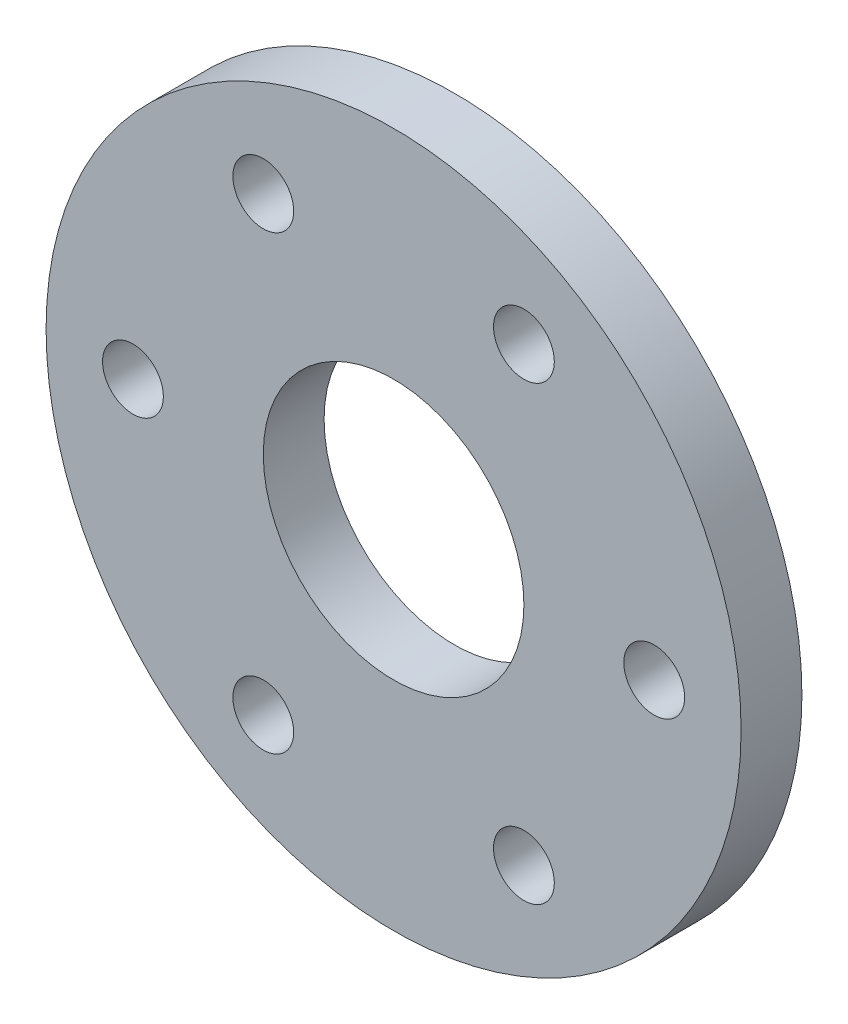
ISO-10303-21;
HEADER;
FILE_DESCRIPTION(('STEP AP214'),'2;1');
FILE_NAME('part.step','',(''),(''),'','','');
FILE_SCHEMA(('AUTOMOTIVE_DESIGN { 1 0 10303 214 1 1 1 1 }'));
ENDSEC;
DATA;
#1=APPLICATION_CONTEXT('core data for automotive mechanical design processes');
#2=APPLICATION_PROTOCOL_DEFINITION('international standard','automotive_design',2000,#1);
#3=PRODUCT_CONTEXT('',#1,'mechanical');
#4=PRODUCT('Part','Part','',(#3));
#5=PRODUCT_RELATED_PRODUCT_CATEGORY('part','',(#4));
#6=PRODUCT_DEFINITION_FORMATION('','',#4);
#7=PRODUCT_DEFINITION_CONTEXT('part definition',#1,'design');
#8=PRODUCT_DEFINITION('design','',#6,#7);
#9=PRODUCT_DEFINITION_SHAPE('','',#8);
#10=(LENGTH_UNIT() NAMED_UNIT(*) SI_UNIT(.MILLI.,.METRE.));
#11=(NAMED_UNIT(*) PLANE_ANGLE_UNIT() SI_UNIT($,.RADIAN.));
#12=(NAMED_UNIT(*) SI_UNIT($,.STERADIAN.) SOLID_ANGLE_UNIT());
#13=UNCERTAINTY_MEASURE_WITH_UNIT(LENGTH_MEASURE(1.E-05),#10,'distance_accuracy_value','');
#14=(GEOMETRIC_REPRESENTATION_CONTEXT(3) GLOBAL_UNCERTAINTY_ASSIGNED_CONTEXT((#13)) GLOBAL_UNIT_ASSIGNED_CONTEXT((#10,
#11,#12)) REPRESENTATION_CONTEXT('',''));
#15=CARTESIAN_POINT('',(0.,0.,0.));
#16=DIRECTION('',(0.,0.,1.));
#17=DIRECTION('',(1.,0.,0.));
#18=AXIS2_PLACEMENT_3D('',#15,#16,#17);
#19=CARTESIAN_POINT('',(0.,0.,14.));
#20=DIRECTION('',(0.,0.,1.));
#21=DIRECTION('',(1.,0.,0.));
#22=AXIS2_PLACEMENT_3D('',#19,#20,#21);
#23=PLANE('',#22);
#24=CARTESIAN_POINT('',(-30.,-51.9615242270663,14.));
#25=DIRECTION('',(0.,0.,1.));
#26=DIRECTION('',(1.,0.,0.));
#27=AXIS2_PLACEMENT_3D('',#24,#25,#26);
#28=CIRCLE('',#27,7.);
#29=CARTESIAN_POINT('',(-23.,-51.9615242270663,14.));
#30=VERTEX_POINT('',#29);
#31=EDGE_CURVE('E73',#30,#30,#28,.T.);
#32=ORIENTED_EDGE('',*,*,#31,.F.);
#33=EDGE_LOOP('',(#32));
#34=FACE_BOUND('',#33,.T.);
#35=CARTESIAN_POINT('',(-30.,51.9615242270663,14.));
#36=DIRECTION('',(0.,0.,1.));
#37=DIRECTION('',(1.,0.,0.));
#38=AXIS2_PLACEMENT_3D('',#35,#36,#37);
#39=CIRCLE('',#38,7.);
#40=CARTESIAN_POINT('',(-23.,51.9615242270663,14.));
#41=VERTEX_POINT('',#40);
#42=EDGE_CURVE('E61',#41,#41,#39,.T.);
#43=ORIENTED_EDGE('',*,*,#42,.F.);
#44=EDGE_LOOP('',(#43));
#45=FACE_BOUND('',#44,.T.);
#46=CARTESIAN_POINT('',(60.,0.,14.));
#47=DIRECTION('',(0.,0.,1.));
#48=DIRECTION('',(1.,0.,0.));
#49=AXIS2_PLACEMENT_3D('',#46,#47,#48);
#50=CIRCLE('',#49,7.00000000000001);
#51=CARTESIAN_POINT('',(67.,0.,14.));
#52=VERTEX_POINT('',#51);
#53=EDGE_CURVE('E49',#52,#52,#50,.T.);
#54=ORIENTED_EDGE('',*,*,#53,.F.);
#55=EDGE_LOOP('',(#54));
#56=FACE_BOUND('',#55,.T.);
#57=CARTESIAN_POINT('',(0.,0.,14.));
#58=DIRECTION('',(0.,0.,1.));
#59=DIRECTION('',(1.,0.,0.));
#60=AXIS2_PLACEMENT_3D('',#57,#58,#59);
#61=CIRCLE('',#60,80.);
#62=CARTESIAN_POINT('',(80.,0.,14.));
#63=VERTEX_POINT('',#62);
#64=EDGE_CURVE('E10',#63,#63,#61,.T.);
#65=ORIENTED_EDGE('',*,*,#64,.T.);
#66=EDGE_LOOP('',(#65));
#67=FACE_BOUND('',#66,.T.);
#68=CARTESIAN_POINT('',(0.,0.,14.));
#69=DIRECTION('',(0.,0.,1.));
#70=DIRECTION('',(1.,0.,0.));
#71=AXIS2_PLACEMENT_3D('',#68,#69,#70);
#72=CIRCLE('',#71,30.);
#73=CARTESIAN_POINT('',(30.,0.,14.));
#74=VERTEX_POINT('',#73);
#75=EDGE_CURVE('E44',#74,#74,#72,.T.);
#76=ORIENTED_EDGE('',*,*,#75,.F.);
#77=EDGE_LOOP('',(#76));
#78=FACE_BOUND('',#77,.T.);
#79=CARTESIAN_POINT('',(30.,51.9615242270663,14.));
#80=DIRECTION('',(0.,0.,1.));
#81=DIRECTION('',(1.,0.,0.));
#82=AXIS2_PLACEMENT_3D('',#79,#80,#81);
#83=CIRCLE('',#82,7.);
#84=CARTESIAN_POINT('',(37.,51.9615242270663,14.));
#85=VERTEX_POINT('',#84);
#86=EDGE_CURVE('E55',#85,#85,#83,.T.);
#87=ORIENTED_EDGE('',*,*,#86,.F.);
#88=EDGE_LOOP('',(#87));
#89=FACE_BOUND('',#88,.T.);
#90=CARTESIAN_POINT('',(-60.,0.,14.));
#91=DIRECTION('',(0.,0.,1.));
#92=DIRECTION('',(1.,0.,0.));
#93=AXIS2_PLACEMENT_3D('',#90,#91,#92);
#94=CIRCLE('',#93,7.);
#95=CARTESIAN_POINT('',(-53.,0.,14.));
#96=VERTEX_POINT('',#95);
#97=EDGE_CURVE('E67',#96,#96,#94,.T.);
#98=ORIENTED_EDGE('',*,*,#97,.F.);
#99=EDGE_LOOP('',(#98));
#100=FACE_BOUND('',#99,.T.);
#101=CARTESIAN_POINT('',(30.,-51.9615242270663,14.));
#102=DIRECTION('',(0.,0.,1.));
#103=DIRECTION('',(1.,0.,0.));
#104=AXIS2_PLACEMENT_3D('',#101,#102,#103);
#105=CIRCLE('',#104,7.);
#106=CARTESIAN_POINT('',(37.,-51.9615242270663,14.));
#107=VERTEX_POINT('',#106);
#108=EDGE_CURVE('E79',#107,#107,#105,.T.);
#109=ORIENTED_EDGE('',*,*,#108,.F.);
#110=EDGE_LOOP('',(#109));
#111=FACE_BOUND('',#110,.T.);
#112=ADVANCED_FACE('F33',(#34,#45,#56,#67,#78,#89,#100,#111),#23,.T.);
#113=CARTESIAN_POINT('',(0.,0.,0.));
#114=DIRECTION('',(0.,0.,1.));
#115=DIRECTION('',(1.,0.,0.));
#116=AXIS2_PLACEMENT_3D('',#113,#114,#115);
#117=PLANE('',#116);
#118=CARTESIAN_POINT('',(0.,0.,0.));
#119=DIRECTION('',(0.,0.,1.));
#120=DIRECTION('',(1.,0.,0.));
#121=AXIS2_PLACEMENT_3D('',#118,#119,#120);
#122=CIRCLE('',#121,80.);
#123=CARTESIAN_POINT('',(80.,0.,0.));
#124=VERTEX_POINT('',#123);
#125=EDGE_CURVE('E37',#124,#124,#122,.T.);
#126=ORIENTED_EDGE('',*,*,#125,.F.);
#127=EDGE_LOOP('',(#126));
#128=FACE_BOUND('',#127,.T.);
#129=CARTESIAN_POINT('',(0.,0.,0.));
#130=DIRECTION('',(0.,0.,1.));
#131=DIRECTION('',(1.,0.,0.));
#132=AXIS2_PLACEMENT_3D('',#129,#130,#131);
#133=CIRCLE('',#132,30.);
#134=CARTESIAN_POINT('',(30.,0.,0.));
#135=VERTEX_POINT('',#134);
#136=EDGE_CURVE('E46',#135,#135,#133,.T.);
#137=ORIENTED_EDGE('',*,*,#136,.T.);
#138=EDGE_LOOP('',(#137));
#139=FACE_BOUND('',#138,.T.);
#140=CARTESIAN_POINT('',(60.,0.,0.));
#141=DIRECTION('',(0.,0.,1.));
#142=DIRECTION('',(1.,0.,0.));
#143=AXIS2_PLACEMENT_3D('',#140,#141,#142);
#144=CIRCLE('',#143,7.00000000000001);
#145=CARTESIAN_POINT('',(67.,0.,0.));
#146=VERTEX_POINT('',#145);
#147=EDGE_CURVE('E52',#146,#146,#144,.T.);
#148=ORIENTED_EDGE('',*,*,#147,.T.);
#149=EDGE_LOOP('',(#148));
#150=FACE_BOUND('',#149,.T.);
#151=CARTESIAN_POINT('',(30.,51.9615242270663,0.));
#152=DIRECTION('',(0.,0.,1.));
#153=DIRECTION('',(1.,0.,0.));
#154=AXIS2_PLACEMENT_3D('',#151,#152,#153);
#155=CIRCLE('',#154,7.);
#156=CARTESIAN_POINT('',(37.,51.9615242270663,0.));
#157=VERTEX_POINT('',#156);
#158=EDGE_CURVE('E58',#157,#157,#155,.T.);
#159=ORIENTED_EDGE('',*,*,#158,.T.);
#160=EDGE_LOOP('',(#159));
#161=FACE_BOUND('',#160,.T.);
#162=CARTESIAN_POINT('',(-30.,51.9615242270663,0.));
#163=DIRECTION('',(0.,0.,1.));
#164=DIRECTION('',(1.,0.,0.));
#165=AXIS2_PLACEMENT_3D('',#162,#163,#164);
#166=CIRCLE('',#165,7.);
#167=CARTESIAN_POINT('',(-23.,51.9615242270663,0.));
#168=VERTEX_POINT('',#167);
#169=EDGE_CURVE('E64',#168,#168,#166,.T.);
#170=ORIENTED_EDGE('',*,*,#169,.T.);
#171=EDGE_LOOP('',(#170));
#172=FACE_BOUND('',#171,.T.);
#173=CARTESIAN_POINT('',(-60.,0.,0.));
#174=DIRECTION('',(0.,0.,1.));
#175=DIRECTION('',(1.,0.,0.));
#176=AXIS2_PLACEMENT_3D('',#173,#174,#175);
#177=CIRCLE('',#176,7.);
#178=CARTESIAN_POINT('',(-53.,0.,0.));
#179=VERTEX_POINT('',#178);
#180=EDGE_CURVE('E70',#179,#179,#177,.T.);
#181=ORIENTED_EDGE('',*,*,#180,.T.);
#182=EDGE_LOOP('',(#181));
#183=FACE_BOUND('',#182,.T.);
#184=CARTESIAN_POINT('',(-30.,-51.9615242270663,0.));
#185=DIRECTION('',(0.,0.,1.));
#186=DIRECTION('',(1.,0.,0.));
#187=AXIS2_PLACEMENT_3D('',#184,#185,#186);
#188=CIRCLE('',#187,7.);
#189=CARTESIAN_POINT('',(-23.,-51.9615242270663,0.));
#190=VERTEX_POINT('',#189);
#191=EDGE_CURVE('E76',#190,#190,#188,.T.);
#192=ORIENTED_EDGE('',*,*,#191,.T.);
#193=EDGE_LOOP('',(#192));
#194=FACE_BOUND('',#193,.T.);
#195=CARTESIAN_POINT('',(30.,-51.9615242270663,0.));
#196=DIRECTION('',(0.,0.,1.));
#197=DIRECTION('',(1.,0.,0.));
#198=AXIS2_PLACEMENT_3D('',#195,#196,#197);
#199=CIRCLE('',#198,7.);
#200=CARTESIAN_POINT('',(37.,-51.9615242270663,0.));
#201=VERTEX_POINT('',#200);
#202=EDGE_CURVE('E82',#201,#201,#199,.T.);
#203=ORIENTED_EDGE('',*,*,#202,.T.);
#204=EDGE_LOOP('',(#203));
#205=FACE_BOUND('',#204,.T.);
#206=ADVANCED_FACE('F92',(#128,#139,#150,#161,#172,#183,#194,#205),#117,.F.);
#207=CARTESIAN_POINT('',(0.,0.,14.));
#208=DIRECTION('',(0.,0.,-1.));
#209=DIRECTION('',(-1.,0.,0.));
#210=AXIS2_PLACEMENT_3D('',#207,#208,#209);
#211=CYLINDRICAL_SURFACE('',#210,80.);
#212=ORIENTED_EDGE('',*,*,#64,.F.);
#213=EDGE_LOOP('',(#212));
#214=FACE_BOUND('',#213,.T.);
#215=ORIENTED_EDGE('',*,*,#125,.T.);
#216=EDGE_LOOP('',(#215));
#217=FACE_BOUND('',#216,.T.);
#218=ADVANCED_FACE('F35',(#214,#217),#211,.T.);
#219=CARTESIAN_POINT('',(0.,0.,14.));
#220=DIRECTION('',(0.,0.,-1.));
#221=DIRECTION('',(-1.,0.,0.));
#222=AXIS2_PLACEMENT_3D('',#219,#220,#221);
#223=CYLINDRICAL_SURFACE('',#222,30.);
#224=ORIENTED_EDGE('',*,*,#75,.T.);
#225=EDGE_LOOP('',(#224));
#226=FACE_BOUND('',#225,.T.);
#227=ORIENTED_EDGE('',*,*,#136,.F.);
#228=EDGE_LOOP('',(#227));
#229=FACE_BOUND('',#228,.T.);
#230=ADVANCED_FACE('F102',(#226,#229),#223,.F.);
#231=CARTESIAN_POINT('',(60.,0.,14.));
#232=DIRECTION('',(0.,0.,-1.));
#233=DIRECTION('',(-1.,0.,0.));
#234=AXIS2_PLACEMENT_3D('',#231,#232,#233);
#235=CYLINDRICAL_SURFACE('',#234,7.00000000000001);
#236=ORIENTED_EDGE('',*,*,#53,.T.);
#237=EDGE_LOOP('',(#236));
#238=FACE_BOUND('',#237,.T.);
#239=ORIENTED_EDGE('',*,*,#147,.F.);
#240=EDGE_LOOP('',(#239));
#241=FACE_BOUND('',#240,.T.);
#242=ADVANCED_FACE('F105',(#238,#241),#235,.F.);
#243=CARTESIAN_POINT('',(30.,51.9615242270663,14.));
#244=DIRECTION('',(0.,0.,-1.));
#245=DIRECTION('',(-1.,0.,0.));
#246=AXIS2_PLACEMENT_3D('',#243,#244,#245);
#247=CYLINDRICAL_SURFACE('',#246,7.);
#248=ORIENTED_EDGE('',*,*,#86,.T.);
#249=EDGE_LOOP('',(#248));
#250=FACE_BOUND('',#249,.T.);
#251=ORIENTED_EDGE('',*,*,#158,.F.);
#252=EDGE_LOOP('',(#251));
#253=FACE_BOUND('',#252,.T.);
#254=ADVANCED_FACE('F109',(#250,#253),#247,.F.);
#255=CARTESIAN_POINT('',(-30.,51.9615242270663,14.));
#256=DIRECTION('',(0.,0.,-1.));
#257=DIRECTION('',(-1.,0.,0.));
#258=AXIS2_PLACEMENT_3D('',#255,#256,#257);
#259=CYLINDRICAL_SURFACE('',#258,7.);
#260=ORIENTED_EDGE('',*,*,#42,.T.);
#261=EDGE_LOOP('',(#260));
#262=FACE_BOUND('',#261,.T.);
#263=ORIENTED_EDGE('',*,*,#169,.F.);
#264=EDGE_LOOP('',(#263));
#265=FACE_BOUND('',#264,.T.);
#266=ADVANCED_FACE('F113',(#262,#265),#259,.F.);
#267=CARTESIAN_POINT('',(-60.,0.,14.));
#268=DIRECTION('',(0.,0.,-1.));
#269=DIRECTION('',(-1.,0.,0.));
#270=AXIS2_PLACEMENT_3D('',#267,#268,#269);
#271=CYLINDRICAL_SURFACE('',#270,7.);
#272=ORIENTED_EDGE('',*,*,#97,.T.);
#273=EDGE_LOOP('',(#272));
#274=FACE_BOUND('',#273,.T.);
#275=ORIENTED_EDGE('',*,*,#180,.F.);
#276=EDGE_LOOP('',(#275));
#277=FACE_BOUND('',#276,.T.);
#278=ADVANCED_FACE('F117',(#274,#277),#271,.F.);
#279=CARTESIAN_POINT('',(-30.,-51.9615242270663,14.));
#280=DIRECTION('',(0.,0.,-1.));
#281=DIRECTION('',(-1.,0.,0.));
#282=AXIS2_PLACEMENT_3D('',#279,#280,#281);
#283=CYLINDRICAL_SURFACE('',#282,7.);
#284=ORIENTED_EDGE('',*,*,#31,.T.);
#285=EDGE_LOOP('',(#284));
#286=FACE_BOUND('',#285,.T.);
#287=ORIENTED_EDGE('',*,*,#191,.F.);
#288=EDGE_LOOP('',(#287));
#289=FACE_BOUND('',#288,.T.);
#290=ADVANCED_FACE('F121',(#286,#289),#283,.F.);
#291=CARTESIAN_POINT('',(30.,-51.9615242270663,14.));
#292=DIRECTION('',(0.,0.,-1.));
#293=DIRECTION('',(-1.,0.,0.));
#294=AXIS2_PLACEMENT_3D('',#291,#292,#293);
#295=CYLINDRICAL_SURFACE('',#294,7.);
#296=ORIENTED_EDGE('',*,*,#108,.T.);
#297=EDGE_LOOP('',(#296));
#298=FACE_BOUND('',#297,.T.);
#299=ORIENTED_EDGE('',*,*,#202,.F.);
#300=EDGE_LOOP('',(#299));
#301=FACE_BOUND('',#300,.T.);
#302=ADVANCED_FACE('F88',(#298,#301),#295,.F.);
#303=CLOSED_SHELL('',(#112,#206,#218,#230,#242,#254,#266,#278,#290,#302));
#304=MANIFOLD_SOLID_BREP('B2',#303);
#305=ADVANCED_BREP_SHAPE_REPRESENTATION('',(#18,#304),#14);
#306=SHAPE_DEFINITION_REPRESENTATION(#9,#305);
ENDSEC;
END-ISO-10303-21;
